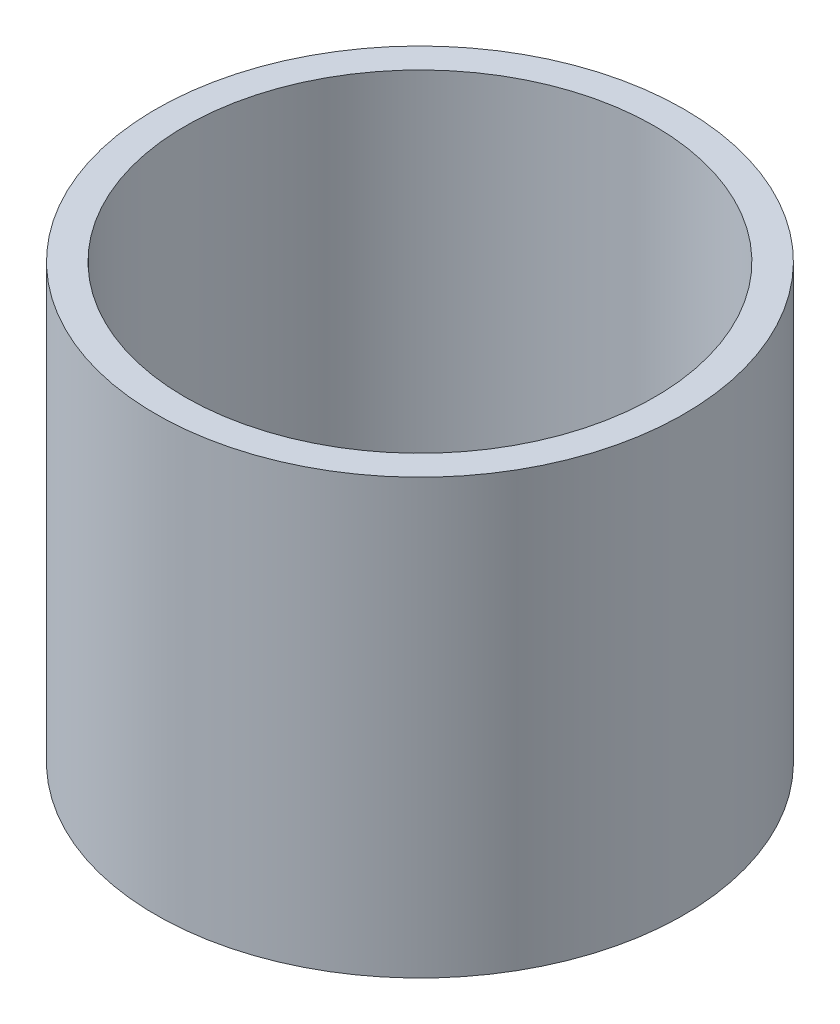
ISO-10303-21;
HEADER;
FILE_DESCRIPTION(('STEP AP214'),'2;1');
FILE_NAME('part.step','',(''),(''),'','','');
FILE_SCHEMA(('AUTOMOTIVE_DESIGN { 1 0 10303 214 1 1 1 1 }'));
ENDSEC;
DATA;
#1=APPLICATION_CONTEXT('core data for automotive mechanical design processes');
#2=APPLICATION_PROTOCOL_DEFINITION('international standard','automotive_design',2000,#1);
#3=PRODUCT_CONTEXT('',#1,'mechanical');
#4=PRODUCT('Part','Part','',(#3));
#5=PRODUCT_RELATED_PRODUCT_CATEGORY('part','',(#4));
#6=PRODUCT_DEFINITION_FORMATION('','',#4);
#7=PRODUCT_DEFINITION_CONTEXT('part definition',#1,'design');
#8=PRODUCT_DEFINITION('design','',#6,#7);
#9=PRODUCT_DEFINITION_SHAPE('','',#8);
#10=(LENGTH_UNIT() NAMED_UNIT(*) SI_UNIT(.MILLI.,.METRE.));
#11=(NAMED_UNIT(*) PLANE_ANGLE_UNIT() SI_UNIT($,.RADIAN.));
#12=(NAMED_UNIT(*) SI_UNIT($,.STERADIAN.) SOLID_ANGLE_UNIT());
#13=UNCERTAINTY_MEASURE_WITH_UNIT(LENGTH_MEASURE(1.E-05),#10,'distance_accuracy_value','');
#14=(GEOMETRIC_REPRESENTATION_CONTEXT(3) GLOBAL_UNCERTAINTY_ASSIGNED_CONTEXT((#13)) GLOBAL_UNIT_ASSIGNED_CONTEXT((#10,
#11,#12)) REPRESENTATION_CONTEXT('',''));
#15=CARTESIAN_POINT('',(0.,0.,0.));
#16=DIRECTION('',(0.,0.,1.));
#17=DIRECTION('',(1.,0.,0.));
#18=AXIS2_PLACEMENT_3D('',#15,#16,#17);
#19=CARTESIAN_POINT('',(0.,0.,0.));
#20=DIRECTION('',(0.,-1.,0.));
#21=DIRECTION('',(0.,0.,-1.));
#22=AXIS2_PLACEMENT_3D('',#19,#20,#21);
#23=CYLINDRICAL_SURFACE('',#22,12.7);
#24=CARTESIAN_POINT('',(0.,0.,0.));
#25=DIRECTION('',(0.,-1.,0.));
#26=DIRECTION('',(0.,0.,-1.));
#27=AXIS2_PLACEMENT_3D('',#24,#25,#26);
#28=CIRCLE('',#27,12.7);
#29=CARTESIAN_POINT('',(0.,0.,-12.7));
#30=VERTEX_POINT('',#29);
#31=EDGE_CURVE('E47',#30,#30,#28,.T.);
#32=ORIENTED_EDGE('',*,*,#31,.T.);
#33=EDGE_LOOP('',(#32));
#34=FACE_BOUND('',#33,.T.);
#35=CARTESIAN_POINT('',(0.,23.46500006,0.));
#36=DIRECTION('',(0.,-1.,0.));
#37=DIRECTION('',(0.,0.,-1.));
#38=AXIS2_PLACEMENT_3D('',#35,#36,#37);
#39=CIRCLE('',#38,12.7);
#40=CARTESIAN_POINT('',(0.,23.46500006,-12.7));
#41=VERTEX_POINT('',#40);
#42=EDGE_CURVE('E10',#41,#41,#39,.T.);
#43=ORIENTED_EDGE('',*,*,#42,.F.);
#44=EDGE_LOOP('',(#43));
#45=FACE_BOUND('',#44,.T.);
#46=ADVANCED_FACE('F33',(#34,#45),#23,.F.);
#47=CARTESIAN_POINT('',(0.,23.46500006,-12.7));
#48=DIRECTION('',(0.,1.,0.));
#49=DIRECTION('',(0.,0.,1.));
#50=AXIS2_PLACEMENT_3D('',#47,#48,#49);
#51=PLANE('',#50);
#52=ORIENTED_EDGE('',*,*,#42,.T.);
#53=EDGE_LOOP('',(#52));
#54=FACE_BOUND('',#53,.T.);
#55=CARTESIAN_POINT('',(0.,23.46500006,0.));
#56=DIRECTION('',(0.,-1.,0.));
#57=DIRECTION('',(0.,0.,-1.));
#58=AXIS2_PLACEMENT_3D('',#55,#56,#57);
#59=CIRCLE('',#58,14.2875);
#60=CARTESIAN_POINT('',(0.,23.46500006,-14.2875));
#61=VERTEX_POINT('',#60);
#62=EDGE_CURVE('E39',#61,#61,#59,.T.);
#63=ORIENTED_EDGE('',*,*,#62,.F.);
#64=EDGE_LOOP('',(#63));
#65=FACE_BOUND('',#64,.T.);
#66=ADVANCED_FACE('F63',(#54,#65),#51,.T.);
#67=CARTESIAN_POINT('',(0.,0.,0.));
#68=DIRECTION('',(0.,-1.,0.));
#69=DIRECTION('',(0.,0.,-1.));
#70=AXIS2_PLACEMENT_3D('',#67,#68,#69);
#71=CYLINDRICAL_SURFACE('',#70,14.2875);
#72=ORIENTED_EDGE('',*,*,#62,.T.);
#73=EDGE_LOOP('',(#72));
#74=FACE_BOUND('',#73,.T.);
#75=CARTESIAN_POINT('',(0.,0.,0.));
#76=DIRECTION('',(0.,-1.,0.));
#77=DIRECTION('',(0.,0.,-1.));
#78=AXIS2_PLACEMENT_3D('',#75,#76,#77);
#79=CIRCLE('',#78,14.2875);
#80=CARTESIAN_POINT('',(0.,0.,-14.2875));
#81=VERTEX_POINT('',#80);
#82=EDGE_CURVE('E43',#81,#81,#79,.T.);
#83=ORIENTED_EDGE('',*,*,#82,.F.);
#84=EDGE_LOOP('',(#83));
#85=FACE_BOUND('',#84,.T.);
#86=ADVANCED_FACE('F57',(#74,#85),#71,.T.);
#87=CARTESIAN_POINT('',(0.,0.,-12.7));
#88=DIRECTION('',(0.,-1.,0.));
#89=DIRECTION('',(0.,0.,-1.));
#90=AXIS2_PLACEMENT_3D('',#87,#88,#89);
#91=PLANE('',#90);
#92=ORIENTED_EDGE('',*,*,#82,.T.);
#93=EDGE_LOOP('',(#92));
#94=FACE_BOUND('',#93,.T.);
#95=ORIENTED_EDGE('',*,*,#31,.F.);
#96=EDGE_LOOP('',(#95));
#97=FACE_BOUND('',#96,.T.);
#98=ADVANCED_FACE('F55',(#94,#97),#91,.T.);
#99=CLOSED_SHELL('',(#46,#66,#86,#98));
#100=MANIFOLD_SOLID_BREP('B2',#99);
#101=ADVANCED_BREP_SHAPE_REPRESENTATION('',(#18,#100),#14);
#102=SHAPE_DEFINITION_REPRESENTATION(#9,#101);
ENDSEC;
END-ISO-10303-21;
